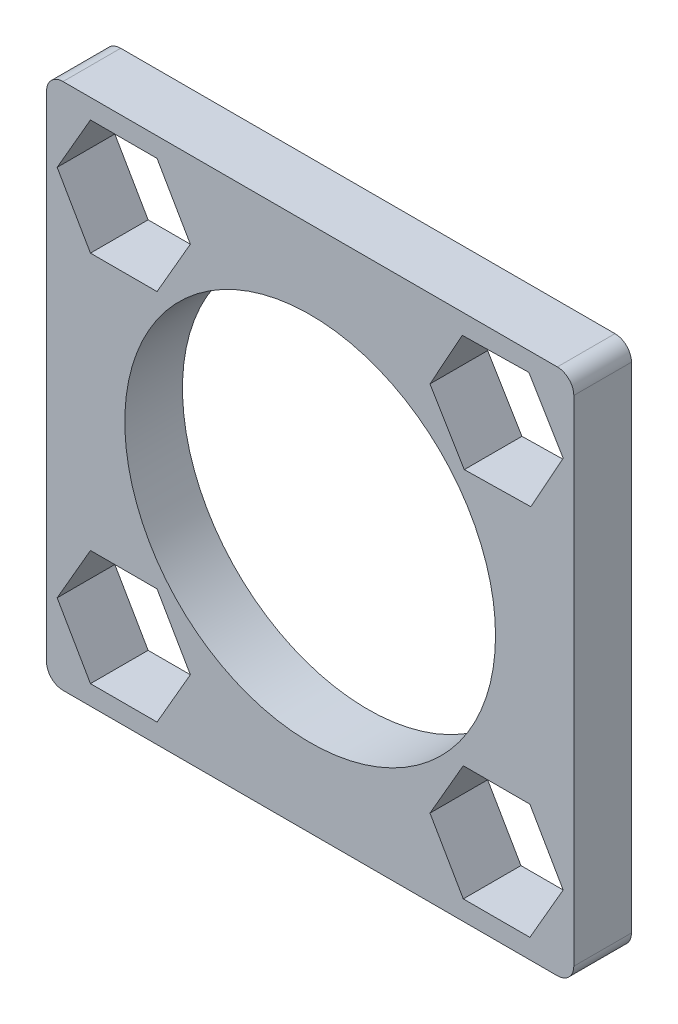
ISO-10303-21;
HEADER;
FILE_DESCRIPTION(('STEP AP214'),'2;1');
FILE_NAME('part.step','',(''),(''),'','','');
FILE_SCHEMA(('AUTOMOTIVE_DESIGN { 1 0 10303 214 1 1 1 1 }'));
ENDSEC;
DATA;
#1=APPLICATION_CONTEXT('core data for automotive mechanical design processes');
#2=APPLICATION_PROTOCOL_DEFINITION('international standard','automotive_design',2000,#1);
#3=PRODUCT_CONTEXT('',#1,'mechanical');
#4=PRODUCT('Part','Part','',(#3));
#5=PRODUCT_RELATED_PRODUCT_CATEGORY('part','',(#4));
#6=PRODUCT_DEFINITION_FORMATION('','',#4);
#7=PRODUCT_DEFINITION_CONTEXT('part definition',#1,'design');
#8=PRODUCT_DEFINITION('design','',#6,#7);
#9=PRODUCT_DEFINITION_SHAPE('','',#8);
#10=(LENGTH_UNIT() NAMED_UNIT(*) SI_UNIT(.MILLI.,.METRE.));
#11=(NAMED_UNIT(*) PLANE_ANGLE_UNIT() SI_UNIT($,.RADIAN.));
#12=(NAMED_UNIT(*) SI_UNIT($,.STERADIAN.) SOLID_ANGLE_UNIT());
#13=UNCERTAINTY_MEASURE_WITH_UNIT(LENGTH_MEASURE(1.E-05),#10,'distance_accuracy_value','');
#14=(GEOMETRIC_REPRESENTATION_CONTEXT(3) GLOBAL_UNCERTAINTY_ASSIGNED_CONTEXT((#13)) GLOBAL_UNIT_ASSIGNED_CONTEXT((#10,
#11,#12)) REPRESENTATION_CONTEXT('',''));
#15=CARTESIAN_POINT('',(0.,0.,0.));
#16=DIRECTION('',(0.,0.,1.));
#17=DIRECTION('',(1.,0.,0.));
#18=AXIS2_PLACEMENT_3D('',#15,#16,#17);
#19=CARTESIAN_POINT('',(-15.,-15.,3.5));
#20=DIRECTION('',(0.,0.,1.));
#21=DIRECTION('',(1.,0.,0.));
#22=AXIS2_PLACEMENT_3D('',#19,#20,#21);
#23=PLANE('',#22);
#24=CARTESIAN_POINT('',(-15.,-15.,3.5));
#25=DIRECTION('',(0.,0.,1.));
#26=DIRECTION('',(1.,0.,0.));
#27=AXIS2_PLACEMENT_3D('',#24,#25,#26);
#28=CIRCLE('',#27,1.);
#29=CARTESIAN_POINT('',(-16.,-15.,3.5));
#30=VERTEX_POINT('',#29);
#31=CARTESIAN_POINT('',(-15.,-16.,3.5));
#32=VERTEX_POINT('',#31);
#33=EDGE_CURVE('E434',#30,#32,#28,.T.);
#34=ORIENTED_EDGE('',*,*,#33,.T.);
#35=DIRECTION('',(1.,0.,0.));
#36=VECTOR('',#35,1.);
#37=CARTESIAN_POINT('',(-15.,-16.,3.5));
#38=LINE('',#37,#36);
#39=CARTESIAN_POINT('',(15.,-16.,3.5));
#40=VERTEX_POINT('',#39);
#41=EDGE_CURVE('E437',#32,#40,#38,.T.);
#42=ORIENTED_EDGE('',*,*,#41,.T.);
#43=CARTESIAN_POINT('',(15.,-15.,3.5));
#44=DIRECTION('',(0.,0.,1.));
#45=DIRECTION('',(1.,0.,0.));
#46=AXIS2_PLACEMENT_3D('',#43,#44,#45);
#47=CIRCLE('',#46,0.999999999999999);
#48=CARTESIAN_POINT('',(16.,-15.,3.5));
#49=VERTEX_POINT('',#48);
#50=EDGE_CURVE('E440',#40,#49,#47,.T.);
#51=ORIENTED_EDGE('',*,*,#50,.T.);
#52=DIRECTION('',(0.,1.,0.));
#53=VECTOR('',#52,1.);
#54=CARTESIAN_POINT('',(16.,15.,3.5));
#55=LINE('',#54,#53);
#56=CARTESIAN_POINT('',(16.,15.,3.5));
#57=VERTEX_POINT('',#56);
#58=EDGE_CURVE('E442',#49,#57,#55,.T.);
#59=ORIENTED_EDGE('',*,*,#58,.T.);
#60=CARTESIAN_POINT('',(15.,15.,3.5));
#61=DIRECTION('',(0.,0.,1.));
#62=DIRECTION('',(-1.,0.,0.));
#63=AXIS2_PLACEMENT_3D('',#60,#61,#62);
#64=CIRCLE('',#63,1.);
#65=CARTESIAN_POINT('',(15.,16.,3.5));
#66=VERTEX_POINT('',#65);
#67=EDGE_CURVE('E444',#57,#66,#64,.T.);
#68=ORIENTED_EDGE('',*,*,#67,.T.);
#69=DIRECTION('',(-1.,0.,0.));
#70=VECTOR('',#69,1.);
#71=CARTESIAN_POINT('',(-15.,16.,3.5));
#72=LINE('',#71,#70);
#73=CARTESIAN_POINT('',(-15.,16.,3.5));
#74=VERTEX_POINT('',#73);
#75=EDGE_CURVE('E446',#66,#74,#72,.T.);
#76=ORIENTED_EDGE('',*,*,#75,.T.);
#77=CARTESIAN_POINT('',(-15.,15.,3.5));
#78=DIRECTION('',(0.,0.,1.));
#79=DIRECTION('',(1.,0.,0.));
#80=AXIS2_PLACEMENT_3D('',#77,#78,#79);
#81=CIRCLE('',#80,1.);
#82=CARTESIAN_POINT('',(-16.,15.,3.5));
#83=VERTEX_POINT('',#82);
#84=EDGE_CURVE('E448',#74,#83,#81,.T.);
#85=ORIENTED_EDGE('',*,*,#84,.T.);
#86=DIRECTION('',(0.,-1.,0.));
#87=VECTOR('',#86,1.);
#88=CARTESIAN_POINT('',(-16.,15.,3.5));
#89=LINE('',#88,#87);
#90=EDGE_CURVE('E450',#83,#30,#89,.T.);
#91=ORIENTED_EDGE('',*,*,#90,.T.);
#92=EDGE_LOOP('',(#34,#42,#51,#59,#68,#76,#85,#91));
#93=FACE_BOUND('',#92,.T.);
#94=CARTESIAN_POINT('',(0.,0.,3.5));
#95=DIRECTION('',(0.,0.,1.));
#96=DIRECTION('',(1.,0.,0.));
#97=AXIS2_PLACEMENT_3D('',#94,#95,#96);
#98=CIRCLE('',#97,11.25);
#99=CARTESIAN_POINT('',(11.25,0.,3.5));
#100=VERTEX_POINT('',#99);
#101=EDGE_CURVE('E428',#100,#100,#98,.T.);
#102=ORIENTED_EDGE('',*,*,#101,.F.);
#103=EDGE_LOOP('',(#102));
#104=FACE_BOUND('',#103,.T.);
#105=DIRECTION('',(-0.5,0.866025403784438,0.));
#106=VECTOR('',#105,1.);
#107=CARTESIAN_POINT('',(-7.27225661465738,11.3137084989848,3.5));
#108=LINE('',#107,#106);
#109=CARTESIAN_POINT('',(-7.27225661465738,11.3137084989848,3.5));
#110=VERTEX_POINT('',#109);
#111=CARTESIAN_POINT('',(-9.29298255682108,14.8137084989848,3.5));
#112=VERTEX_POINT('',#111);
#113=EDGE_CURVE('E385',#110,#112,#108,.T.);
#114=ORIENTED_EDGE('',*,*,#113,.F.);
#115=DIRECTION('',(0.5,0.866025403784439,0.));
#116=VECTOR('',#115,1.);
#117=CARTESIAN_POINT('',(-9.29298255682107,7.81370849898475,3.5));
#118=LINE('',#117,#116);
#119=CARTESIAN_POINT('',(-9.29298255682107,7.81370849898475,3.5));
#120=VERTEX_POINT('',#119);
#121=EDGE_CURVE('E383',#120,#110,#118,.T.);
#122=ORIENTED_EDGE('',*,*,#121,.F.);
#123=DIRECTION('',(1.,0.,0.));
#124=VECTOR('',#123,1.);
#125=CARTESIAN_POINT('',(-13.3344344411485,7.81370849898475,3.5));
#126=LINE('',#125,#124);
#127=CARTESIAN_POINT('',(-13.3344344411485,7.81370849898475,3.5));
#128=VERTEX_POINT('',#127);
#129=EDGE_CURVE('E395',#128,#120,#126,.T.);
#130=ORIENTED_EDGE('',*,*,#129,.F.);
#131=DIRECTION('',(0.5,-0.866025403784438,0.));
#132=VECTOR('',#131,1.);
#133=CARTESIAN_POINT('',(-15.3551603833122,11.3137084989848,3.5));
#134=LINE('',#133,#132);
#135=CARTESIAN_POINT('',(-15.3551603833122,11.3137084989848,3.5));
#136=VERTEX_POINT('',#135);
#137=EDGE_CURVE('E392',#136,#128,#134,.T.);
#138=ORIENTED_EDGE('',*,*,#137,.F.);
#139=DIRECTION('',(-0.5,-0.866025403784438,0.));
#140=VECTOR('',#139,1.);
#141=CARTESIAN_POINT('',(-13.3344344411485,14.8137084989848,3.5));
#142=LINE('',#141,#140);
#143=CARTESIAN_POINT('',(-13.3344344411485,14.8137084989848,3.5));
#144=VERTEX_POINT('',#143);
#145=EDGE_CURVE('E390',#144,#136,#142,.T.);
#146=ORIENTED_EDGE('',*,*,#145,.F.);
#147=DIRECTION('',(-1.,0.,0.));
#148=VECTOR('',#147,1.);
#149=CARTESIAN_POINT('',(-9.29298255682108,14.8137084989848,3.5));
#150=LINE('',#149,#148);
#151=EDGE_CURVE('E388',#112,#144,#150,.T.);
#152=ORIENTED_EDGE('',*,*,#151,.F.);
#153=EDGE_LOOP('',(#114,#122,#130,#138,#146,#152));
#154=FACE_BOUND('',#153,.T.);
#155=DIRECTION('',(0.514888429763945,-0.857257198800464,0.));
#156=VECTOR('',#155,1.);
#157=CARTESIAN_POINT('',(7.27285989583921,11.2438808555336,3.5));
#158=LINE('',#157,#156);
#159=CARTESIAN_POINT('',(7.27285989583921,11.2438808555336,3.5));
#160=VERTEX_POINT('',#159);
#161=CARTESIAN_POINT('',(9.35375671052707,7.77931713408829,3.5));
#162=VERTEX_POINT('',#161);
#163=EDGE_CURVE('E340',#160,#162,#158,.T.);
#164=ORIENTED_EDGE('',*,*,#163,.F.);
#165=DIRECTION('',(-0.484962296856316,-0.874535059690489,0.));
#166=VECTOR('',#165,1.);
#167=CARTESIAN_POINT('',(9.23281168429691,14.7782722204301,3.5));
#168=LINE('',#167,#166);
#169=CARTESIAN_POINT('',(9.23281168429691,14.7782722204301,3.5));
#170=VERTEX_POINT('',#169);
#171=EDGE_CURVE('E338',#170,#160,#168,.T.);
#172=ORIENTED_EDGE('',*,*,#171,.F.);
#173=DIRECTION('',(-0.999850726620261,-0.0172778608900245,0.));
#174=VECTOR('',#173,1.);
#175=CARTESIAN_POINT('',(13.2736602874425,14.8480998638813,3.5));
#176=LINE('',#175,#174);
#177=CARTESIAN_POINT('',(13.2736602874425,14.8480998638813,3.5));
#178=VERTEX_POINT('',#177);
#179=EDGE_CURVE('E350',#178,#170,#176,.T.);
#180=ORIENTED_EDGE('',*,*,#179,.F.);
#181=DIRECTION('',(-0.514888429763945,0.857257198800464,0.));
#182=VECTOR('',#181,1.);
#183=CARTESIAN_POINT('',(15.3545571021303,11.3835361424359,3.5));
#184=LINE('',#183,#182);
#185=CARTESIAN_POINT('',(15.3545571021303,11.3835361424359,3.5));
#186=VERTEX_POINT('',#185);
#187=EDGE_CURVE('E347',#186,#178,#184,.T.);
#188=ORIENTED_EDGE('',*,*,#187,.F.);
#189=DIRECTION('',(0.484962296856316,0.874535059690489,0.));
#190=VECTOR('',#189,1.);
#191=CARTESIAN_POINT('',(13.3946053136726,7.84914477753942,3.5));
#192=LINE('',#191,#190);
#193=CARTESIAN_POINT('',(13.3946053136726,7.84914477753942,3.5));
#194=VERTEX_POINT('',#193);
#195=EDGE_CURVE('E345',#194,#186,#192,.T.);
#196=ORIENTED_EDGE('',*,*,#195,.F.);
#197=DIRECTION('',(0.999850726620262,0.0172778608900245,0.));
#198=VECTOR('',#197,1.);
#199=CARTESIAN_POINT('',(9.35375671052707,7.77931713408829,3.5));
#200=LINE('',#199,#198);
#201=EDGE_CURVE('E343',#162,#194,#200,.T.);
#202=ORIENTED_EDGE('',*,*,#201,.F.);
#203=EDGE_LOOP('',(#164,#172,#180,#188,#196,#202));
#204=FACE_BOUND('',#203,.T.);
#205=DIRECTION('',(-0.500000000000001,0.866025403784438,0.));
#206=VECTOR('',#205,1.);
#207=CARTESIAN_POINT('',(-7.27225661465738,-11.3137084989848,3.5));
#208=LINE('',#207,#206);
#209=CARTESIAN_POINT('',(-7.27225661465738,-11.3137084989848,3.5));
#210=VERTEX_POINT('',#209);
#211=CARTESIAN_POINT('',(-9.29298255682108,-7.81370849898476,3.5));
#212=VERTEX_POINT('',#211);
#213=EDGE_CURVE('E295',#210,#212,#208,.T.);
#214=ORIENTED_EDGE('',*,*,#213,.F.);
#215=DIRECTION('',(0.499999999999995,0.866025403784442,0.));
#216=VECTOR('',#215,1.);
#217=CARTESIAN_POINT('',(-9.29298255682103,-14.8137084989847,3.5));
#218=LINE('',#217,#216);
#219=CARTESIAN_POINT('',(-9.29298255682103,-14.8137084989847,3.5));
#220=VERTEX_POINT('',#219);
#221=EDGE_CURVE('E293',#220,#210,#218,.T.);
#222=ORIENTED_EDGE('',*,*,#221,.F.);
#223=DIRECTION('',(1.,0.,0.));
#224=VECTOR('',#223,1.);
#225=CARTESIAN_POINT('',(-13.3344344411484,-14.8137084989848,3.5));
#226=LINE('',#225,#224);
#227=CARTESIAN_POINT('',(-13.3344344411484,-14.8137084989848,3.5));
#228=VERTEX_POINT('',#227);
#229=EDGE_CURVE('E305',#228,#220,#226,.T.);
#230=ORIENTED_EDGE('',*,*,#229,.F.);
#231=DIRECTION('',(0.500000000000007,-0.866025403784435,0.));
#232=VECTOR('',#231,1.);
#233=CARTESIAN_POINT('',(-15.3551603833121,-11.3137084989848,3.5));
#234=LINE('',#233,#232);
#235=CARTESIAN_POINT('',(-15.3551603833121,-11.3137084989848,3.5));
#236=VERTEX_POINT('',#235);
#237=EDGE_CURVE('E302',#236,#228,#234,.T.);
#238=ORIENTED_EDGE('',*,*,#237,.F.);
#239=DIRECTION('',(-0.499999999999995,-0.866025403784442,0.));
#240=VECTOR('',#239,1.);
#241=CARTESIAN_POINT('',(-13.3344344411485,-7.81370849898477,3.5));
#242=LINE('',#241,#240);
#243=CARTESIAN_POINT('',(-13.3344344411485,-7.81370849898477,3.5));
#244=VERTEX_POINT('',#243);
#245=EDGE_CURVE('E300',#244,#236,#242,.T.);
#246=ORIENTED_EDGE('',*,*,#245,.F.);
#247=DIRECTION('',(-1.,0.,0.));
#248=VECTOR('',#247,1.);
#249=CARTESIAN_POINT('',(-9.29298255682108,-7.81370849898476,3.5));
#250=LINE('',#249,#248);
#251=EDGE_CURVE('E298',#212,#244,#250,.T.);
#252=ORIENTED_EDGE('',*,*,#251,.F.);
#253=EDGE_LOOP('',(#214,#222,#230,#238,#246,#252));
#254=FACE_BOUND('',#253,.T.);
#255=DIRECTION('',(-0.5,0.866025403784438,0.));
#256=VECTOR('',#255,1.);
#257=CARTESIAN_POINT('',(15.3551603833121,-11.3137084989848,3.5));
#258=LINE('',#257,#256);
#259=CARTESIAN_POINT('',(15.3551603833121,-11.3137084989848,3.5));
#260=VERTEX_POINT('',#259);
#261=CARTESIAN_POINT('',(13.3344344411484,-7.81370849898475,3.5));
#262=VERTEX_POINT('',#261);
#263=EDGE_CURVE('E250',#260,#262,#258,.T.);
#264=ORIENTED_EDGE('',*,*,#263,.F.);
#265=DIRECTION('',(0.5,0.866025403784439,0.));
#266=VECTOR('',#265,1.);
#267=CARTESIAN_POINT('',(13.3344344411484,-14.8137084989848,3.5));
#268=LINE('',#267,#266);
#269=CARTESIAN_POINT('',(13.3344344411484,-14.8137084989848,3.5));
#270=VERTEX_POINT('',#269);
#271=EDGE_CURVE('E242',#270,#260,#268,.T.);
#272=ORIENTED_EDGE('',*,*,#271,.F.);
#273=DIRECTION('',(1.,0.,0.));
#274=VECTOR('',#273,1.);
#275=CARTESIAN_POINT('',(9.29298255682106,-14.8137084989848,3.5));
#276=LINE('',#275,#274);
#277=CARTESIAN_POINT('',(9.29298255682106,-14.8137084989848,3.5));
#278=VERTEX_POINT('',#277);
#279=EDGE_CURVE('E271',#278,#270,#276,.T.);
#280=ORIENTED_EDGE('',*,*,#279,.F.);
#281=DIRECTION('',(0.5,-0.866025403784438,0.));
#282=VECTOR('',#281,1.);
#283=CARTESIAN_POINT('',(7.27225661465737,-11.3137084989848,3.5));
#284=LINE('',#283,#282);
#285=CARTESIAN_POINT('',(7.27225661465737,-11.3137084989848,3.5));
#286=VERTEX_POINT('',#285);
#287=EDGE_CURVE('E269',#286,#278,#284,.T.);
#288=ORIENTED_EDGE('',*,*,#287,.F.);
#289=DIRECTION('',(-0.5,-0.866025403784439,0.));
#290=VECTOR('',#289,1.);
#291=CARTESIAN_POINT('',(9.29298255682106,-7.81370849898475,3.5));
#292=LINE('',#291,#290);
#293=CARTESIAN_POINT('',(9.29298255682106,-7.81370849898475,3.5));
#294=VERTEX_POINT('',#293);
#295=EDGE_CURVE('E265',#294,#286,#292,.T.);
#296=ORIENTED_EDGE('',*,*,#295,.F.);
#297=DIRECTION('',(-1.,0.,0.));
#298=VECTOR('',#297,1.);
#299=CARTESIAN_POINT('',(13.3344344411484,-7.81370849898475,3.5));
#300=LINE('',#299,#298);
#301=EDGE_CURVE('E263',#262,#294,#300,.T.);
#302=ORIENTED_EDGE('',*,*,#301,.F.);
#303=EDGE_LOOP('',(#264,#272,#280,#288,#296,#302));
#304=FACE_BOUND('',#303,.T.);
#305=ADVANCED_FACE('F33',(#93,#104,#154,#204,#254,#304),#23,.T.);
#306=CARTESIAN_POINT('',(-15.,-15.,0.));
#307=DIRECTION('',(0.,0.,1.));
#308=DIRECTION('',(1.,0.,0.));
#309=AXIS2_PLACEMENT_3D('',#306,#307,#308);
#310=PLANE('',#309);
#311=DIRECTION('',(0.499999999999995,0.866025403784442,0.));
#312=VECTOR('',#311,1.);
#313=CARTESIAN_POINT('',(-9.29298255682103,-14.8137084989847,0.));
#314=LINE('',#313,#312);
#315=CARTESIAN_POINT('',(-9.29298255682103,-14.8137084989847,0.));
#316=VERTEX_POINT('',#315);
#317=CARTESIAN_POINT('',(-7.27225661465738,-11.3137084989848,0.));
#318=VERTEX_POINT('',#317);
#319=EDGE_CURVE('E258',#316,#318,#314,.T.);
#320=ORIENTED_EDGE('',*,*,#319,.T.);
#321=DIRECTION('',(-0.500000000000001,0.866025403784438,0.));
#322=VECTOR('',#321,1.);
#323=CARTESIAN_POINT('',(-7.27225661465738,-11.3137084989848,0.));
#324=LINE('',#323,#322);
#325=CARTESIAN_POINT('',(-9.29298255682108,-7.81370849898476,0.));
#326=VERTEX_POINT('',#325);
#327=EDGE_CURVE('E310',#318,#326,#324,.T.);
#328=ORIENTED_EDGE('',*,*,#327,.T.);
#329=DIRECTION('',(-1.,0.,0.));
#330=VECTOR('',#329,1.);
#331=CARTESIAN_POINT('',(-9.29298255682108,-7.81370849898476,0.));
#332=LINE('',#331,#330);
#333=CARTESIAN_POINT('',(-13.3344344411485,-7.81370849898477,0.));
#334=VERTEX_POINT('',#333);
#335=EDGE_CURVE('E313',#326,#334,#332,.T.);
#336=ORIENTED_EDGE('',*,*,#335,.T.);
#337=DIRECTION('',(-0.499999999999995,-0.866025403784442,0.));
#338=VECTOR('',#337,1.);
#339=CARTESIAN_POINT('',(-13.3344344411485,-7.81370849898477,0.));
#340=LINE('',#339,#338);
#341=CARTESIAN_POINT('',(-15.3551603833121,-11.3137084989848,0.));
#342=VERTEX_POINT('',#341);
#343=EDGE_CURVE('E316',#334,#342,#340,.T.);
#344=ORIENTED_EDGE('',*,*,#343,.T.);
#345=DIRECTION('',(0.500000000000007,-0.866025403784435,0.));
#346=VECTOR('',#345,1.);
#347=CARTESIAN_POINT('',(-15.3551603833121,-11.3137084989848,0.));
#348=LINE('',#347,#346);
#349=CARTESIAN_POINT('',(-13.3344344411484,-14.8137084989848,0.));
#350=VERTEX_POINT('',#349);
#351=EDGE_CURVE('E319',#342,#350,#348,.T.);
#352=ORIENTED_EDGE('',*,*,#351,.T.);
#353=DIRECTION('',(1.,0.,0.));
#354=VECTOR('',#353,1.);
#355=CARTESIAN_POINT('',(-13.3344344411484,-14.8137084989848,0.));
#356=LINE('',#355,#354);
#357=EDGE_CURVE('E296',#350,#316,#356,.T.);
#358=ORIENTED_EDGE('',*,*,#357,.T.);
#359=EDGE_LOOP('',(#320,#328,#336,#344,#352,#358));
#360=FACE_BOUND('',#359,.T.);
#361=DIRECTION('',(0.5,0.866025403784439,0.));
#362=VECTOR('',#361,1.);
#363=CARTESIAN_POINT('',(-9.29298255682107,7.81370849898475,0.));
#364=LINE('',#363,#362);
#365=CARTESIAN_POINT('',(-9.29298255682107,7.81370849898475,0.));
#366=VERTEX_POINT('',#365);
#367=CARTESIAN_POINT('',(-7.27225661465738,11.3137084989848,0.));
#368=VERTEX_POINT('',#367);
#369=EDGE_CURVE('E382',#366,#368,#364,.T.);
#370=ORIENTED_EDGE('',*,*,#369,.T.);
#371=DIRECTION('',(-0.5,0.866025403784438,0.));
#372=VECTOR('',#371,1.);
#373=CARTESIAN_POINT('',(-7.27225661465738,11.3137084989848,0.));
#374=LINE('',#373,#372);
#375=CARTESIAN_POINT('',(-9.29298255682108,14.8137084989848,0.));
#376=VERTEX_POINT('',#375);
#377=EDGE_CURVE('E400',#368,#376,#374,.T.);
#378=ORIENTED_EDGE('',*,*,#377,.T.);
#379=DIRECTION('',(-1.,0.,0.));
#380=VECTOR('',#379,1.);
#381=CARTESIAN_POINT('',(-9.29298255682108,14.8137084989848,0.));
#382=LINE('',#381,#380);
#383=CARTESIAN_POINT('',(-13.3344344411485,14.8137084989848,0.));
#384=VERTEX_POINT('',#383);
#385=EDGE_CURVE('E403',#376,#384,#382,.T.);
#386=ORIENTED_EDGE('',*,*,#385,.T.);
#387=DIRECTION('',(-0.5,-0.866025403784438,0.));
#388=VECTOR('',#387,1.);
#389=CARTESIAN_POINT('',(-13.3344344411485,14.8137084989848,0.));
#390=LINE('',#389,#388);
#391=CARTESIAN_POINT('',(-15.3551603833122,11.3137084989848,0.));
#392=VERTEX_POINT('',#391);
#393=EDGE_CURVE('E406',#384,#392,#390,.T.);
#394=ORIENTED_EDGE('',*,*,#393,.T.);
#395=DIRECTION('',(0.5,-0.866025403784438,0.));
#396=VECTOR('',#395,1.);
#397=CARTESIAN_POINT('',(-15.3551603833122,11.3137084989848,0.));
#398=LINE('',#397,#396);
#399=CARTESIAN_POINT('',(-13.3344344411485,7.81370849898475,0.));
#400=VERTEX_POINT('',#399);
#401=EDGE_CURVE('E409',#392,#400,#398,.T.);
#402=ORIENTED_EDGE('',*,*,#401,.T.);
#403=DIRECTION('',(1.,0.,0.));
#404=VECTOR('',#403,1.);
#405=CARTESIAN_POINT('',(-13.3344344411485,7.81370849898475,0.));
#406=LINE('',#405,#404);
#407=EDGE_CURVE('E386',#400,#366,#406,.T.);
#408=ORIENTED_EDGE('',*,*,#407,.T.);
#409=EDGE_LOOP('',(#370,#378,#386,#394,#402,#408));
#410=FACE_BOUND('',#409,.T.);
#411=CARTESIAN_POINT('',(-15.,-15.,0.));
#412=DIRECTION('',(0.,0.,1.));
#413=DIRECTION('',(1.,0.,0.));
#414=AXIS2_PLACEMENT_3D('',#411,#412,#413);
#415=CIRCLE('',#414,1.);
#416=CARTESIAN_POINT('',(-16.,-15.,0.));
#417=VERTEX_POINT('',#416);
#418=CARTESIAN_POINT('',(-15.,-16.,0.));
#419=VERTEX_POINT('',#418);
#420=EDGE_CURVE('E431',#417,#419,#415,.T.);
#421=ORIENTED_EDGE('',*,*,#420,.F.);
#422=DIRECTION('',(0.,-1.,0.));
#423=VECTOR('',#422,1.);
#424=CARTESIAN_POINT('',(-16.,15.,0.));
#425=LINE('',#424,#423);
#426=CARTESIAN_POINT('',(-16.,15.,0.));
#427=VERTEX_POINT('',#426);
#428=EDGE_CURVE('E438',#427,#417,#425,.T.);
#429=ORIENTED_EDGE('',*,*,#428,.F.);
#430=CARTESIAN_POINT('',(-15.,15.,0.));
#431=DIRECTION('',(0.,0.,1.));
#432=DIRECTION('',(1.,0.,0.));
#433=AXIS2_PLACEMENT_3D('',#430,#431,#432);
#434=CIRCLE('',#433,1.);
#435=CARTESIAN_POINT('',(-15.,16.,0.));
#436=VERTEX_POINT('',#435);
#437=EDGE_CURVE('E465',#436,#427,#434,.T.);
#438=ORIENTED_EDGE('',*,*,#437,.F.);
#439=DIRECTION('',(-1.,0.,0.));
#440=VECTOR('',#439,1.);
#441=CARTESIAN_POINT('',(-15.,16.,0.));
#442=LINE('',#441,#440);
#443=CARTESIAN_POINT('',(15.,16.,0.));
#444=VERTEX_POINT('',#443);
#445=EDGE_CURVE('E463',#444,#436,#442,.T.);
#446=ORIENTED_EDGE('',*,*,#445,.F.);
#447=CARTESIAN_POINT('',(15.,15.,0.));
#448=DIRECTION('',(0.,0.,1.));
#449=DIRECTION('',(-1.,0.,0.));
#450=AXIS2_PLACEMENT_3D('',#447,#448,#449);
#451=CIRCLE('',#450,1.);
#452=CARTESIAN_POINT('',(16.,15.,0.));
#453=VERTEX_POINT('',#452);
#454=EDGE_CURVE('E461',#453,#444,#451,.T.);
#455=ORIENTED_EDGE('',*,*,#454,.F.);
#456=DIRECTION('',(0.,1.,0.));
#457=VECTOR('',#456,1.);
#458=CARTESIAN_POINT('',(16.,15.,0.));
#459=LINE('',#458,#457);
#460=CARTESIAN_POINT('',(16.,-15.,0.));
#461=VERTEX_POINT('',#460);
#462=EDGE_CURVE('E459',#461,#453,#459,.T.);
#463=ORIENTED_EDGE('',*,*,#462,.F.);
#464=CARTESIAN_POINT('',(15.,-15.,0.));
#465=DIRECTION('',(0.,0.,1.));
#466=DIRECTION('',(1.,0.,0.));
#467=AXIS2_PLACEMENT_3D('',#464,#465,#466);
#468=CIRCLE('',#467,0.999999999999999);
#469=CARTESIAN_POINT('',(15.,-16.,0.));
#470=VERTEX_POINT('',#469);
#471=EDGE_CURVE('E457',#470,#461,#468,.T.);
#472=ORIENTED_EDGE('',*,*,#471,.F.);
#473=DIRECTION('',(1.,0.,0.));
#474=VECTOR('',#473,1.);
#475=CARTESIAN_POINT('',(-15.,-16.,0.));
#476=LINE('',#475,#474);
#477=EDGE_CURVE('E455',#419,#470,#476,.T.);
#478=ORIENTED_EDGE('',*,*,#477,.F.);
#479=EDGE_LOOP('',(#421,#429,#438,#446,#455,#463,#472,#478));
#480=FACE_BOUND('',#479,.T.);
#481=CARTESIAN_POINT('',(0.,0.,0.));
#482=DIRECTION('',(0.,0.,1.));
#483=DIRECTION('',(1.,0.,0.));
#484=AXIS2_PLACEMENT_3D('',#481,#482,#483);
#485=CIRCLE('',#484,11.25);
#486=CARTESIAN_POINT('',(11.25,0.,0.));
#487=VERTEX_POINT('',#486);
#488=EDGE_CURVE('E427',#487,#487,#485,.T.);
#489=ORIENTED_EDGE('',*,*,#488,.T.);
#490=EDGE_LOOP('',(#489));
#491=FACE_BOUND('',#490,.T.);
#492=DIRECTION('',(-0.484962296856316,-0.874535059690489,0.));
#493=VECTOR('',#492,1.);
#494=CARTESIAN_POINT('',(9.23281168429691,14.7782722204301,0.));
#495=LINE('',#494,#493);
#496=CARTESIAN_POINT('',(9.23281168429691,14.7782722204301,0.));
#497=VERTEX_POINT('',#496);
#498=CARTESIAN_POINT('',(7.27285989583921,11.2438808555336,0.));
#499=VERTEX_POINT('',#498);
#500=EDGE_CURVE('E337',#497,#499,#495,.T.);
#501=ORIENTED_EDGE('',*,*,#500,.T.);
#502=DIRECTION('',(0.514888429763945,-0.857257198800464,0.));
#503=VECTOR('',#502,1.);
#504=CARTESIAN_POINT('',(7.27285989583921,11.2438808555336,0.));
#505=LINE('',#504,#503);
#506=CARTESIAN_POINT('',(9.35375671052707,7.77931713408829,0.));
#507=VERTEX_POINT('',#506);
#508=EDGE_CURVE('E355',#499,#507,#505,.T.);
#509=ORIENTED_EDGE('',*,*,#508,.T.);
#510=DIRECTION('',(0.999850726620262,0.0172778608900245,0.));
#511=VECTOR('',#510,1.);
#512=CARTESIAN_POINT('',(9.35375671052707,7.77931713408829,0.));
#513=LINE('',#512,#511);
#514=CARTESIAN_POINT('',(13.3946053136726,7.84914477753942,0.));
#515=VERTEX_POINT('',#514);
#516=EDGE_CURVE('E358',#507,#515,#513,.T.);
#517=ORIENTED_EDGE('',*,*,#516,.T.);
#518=DIRECTION('',(0.484962296856316,0.874535059690489,0.));
#519=VECTOR('',#518,1.);
#520=CARTESIAN_POINT('',(13.3946053136726,7.84914477753942,0.));
#521=LINE('',#520,#519);
#522=CARTESIAN_POINT('',(15.3545571021303,11.3835361424359,0.));
#523=VERTEX_POINT('',#522);
#524=EDGE_CURVE('E361',#515,#523,#521,.T.);
#525=ORIENTED_EDGE('',*,*,#524,.T.);
#526=DIRECTION('',(-0.514888429763945,0.857257198800464,0.));
#527=VECTOR('',#526,1.);
#528=CARTESIAN_POINT('',(15.3545571021303,11.3835361424359,0.));
#529=LINE('',#528,#527);
#530=CARTESIAN_POINT('',(13.2736602874425,14.8480998638813,0.));
#531=VERTEX_POINT('',#530);
#532=EDGE_CURVE('E364',#523,#531,#529,.T.);
#533=ORIENTED_EDGE('',*,*,#532,.T.);
#534=DIRECTION('',(-0.999850726620261,-0.0172778608900245,0.));
#535=VECTOR('',#534,1.);
#536=CARTESIAN_POINT('',(13.2736602874425,14.8480998638813,0.));
#537=LINE('',#536,#535);
#538=EDGE_CURVE('E341',#531,#497,#537,.T.);
#539=ORIENTED_EDGE('',*,*,#538,.T.);
#540=EDGE_LOOP('',(#501,#509,#517,#525,#533,#539));
#541=FACE_BOUND('',#540,.T.);
#542=DIRECTION('',(0.5,0.866025403784439,0.));
#543=VECTOR('',#542,1.);
#544=CARTESIAN_POINT('',(13.3344344411484,-14.8137084989848,0.));
#545=LINE('',#544,#543);
#546=CARTESIAN_POINT('',(13.3344344411484,-14.8137084989848,0.));
#547=VERTEX_POINT('',#546);
#548=CARTESIAN_POINT('',(15.3551603833121,-11.3137084989848,0.));
#549=VERTEX_POINT('',#548);
#550=EDGE_CURVE('E56',#547,#549,#545,.T.);
#551=ORIENTED_EDGE('',*,*,#550,.T.);
#552=DIRECTION('',(-0.5,0.866025403784438,0.));
#553=VECTOR('',#552,1.);
#554=CARTESIAN_POINT('',(15.3551603833121,-11.3137084989848,0.));
#555=LINE('',#554,#553);
#556=CARTESIAN_POINT('',(13.3344344411484,-7.81370849898475,0.));
#557=VERTEX_POINT('',#556);
#558=EDGE_CURVE('E257',#549,#557,#555,.T.);
#559=ORIENTED_EDGE('',*,*,#558,.T.);
#560=DIRECTION('',(-1.,0.,0.));
#561=VECTOR('',#560,1.);
#562=CARTESIAN_POINT('',(13.3344344411484,-7.81370849898475,0.));
#563=LINE('',#562,#561);
#564=CARTESIAN_POINT('',(9.29298255682106,-7.81370849898475,0.));
#565=VERTEX_POINT('',#564);
#566=EDGE_CURVE('E275',#557,#565,#563,.T.);
#567=ORIENTED_EDGE('',*,*,#566,.T.);
#568=DIRECTION('',(-0.5,-0.866025403784439,0.));
#569=VECTOR('',#568,1.);
#570=CARTESIAN_POINT('',(9.29298255682106,-7.81370849898475,0.));
#571=LINE('',#570,#569);
#572=CARTESIAN_POINT('',(7.27225661465737,-11.3137084989848,0.));
#573=VERTEX_POINT('',#572);
#574=EDGE_CURVE('E278',#565,#573,#571,.T.);
#575=ORIENTED_EDGE('',*,*,#574,.T.);
#576=DIRECTION('',(0.5,-0.866025403784438,0.));
#577=VECTOR('',#576,1.);
#578=CARTESIAN_POINT('',(7.27225661465737,-11.3137084989848,0.));
#579=LINE('',#578,#577);
#580=CARTESIAN_POINT('',(9.29298255682106,-14.8137084989848,0.));
#581=VERTEX_POINT('',#580);
#582=EDGE_CURVE('E281',#573,#581,#579,.T.);
#583=ORIENTED_EDGE('',*,*,#582,.T.);
#584=DIRECTION('',(1.,0.,0.));
#585=VECTOR('',#584,1.);
#586=CARTESIAN_POINT('',(9.29298255682106,-14.8137084989848,0.));
#587=LINE('',#586,#585);
#588=EDGE_CURVE('E251',#581,#547,#587,.T.);
#589=ORIENTED_EDGE('',*,*,#588,.T.);
#590=EDGE_LOOP('',(#551,#559,#567,#575,#583,#589));
#591=FACE_BOUND('',#590,.T.);
#592=ADVANCED_FACE('F495',(#360,#410,#480,#491,#541,#591),#310,.F.);
#593=CARTESIAN_POINT('',(-15.,-15.,3.5));
#594=DIRECTION('',(0.,0.,-1.));
#595=DIRECTION('',(-1.,0.,0.));
#596=AXIS2_PLACEMENT_3D('',#593,#594,#595);
#597=CYLINDRICAL_SURFACE('',#596,1.);
#598=ORIENTED_EDGE('',*,*,#420,.T.);
#599=DIRECTION('',(0.,0.,-1.));
#600=VECTOR('',#599,1.);
#601=CARTESIAN_POINT('',(-15.,-16.,3.5));
#602=LINE('',#601,#600);
#603=EDGE_CURVE('E11',#32,#419,#602,.T.);
#604=ORIENTED_EDGE('',*,*,#603,.F.);
#605=ORIENTED_EDGE('',*,*,#33,.F.);
#606=DIRECTION('',(0.,0.,-1.));
#607=VECTOR('',#606,1.);
#608=CARTESIAN_POINT('',(-16.,-15.,3.5));
#609=LINE('',#608,#607);
#610=EDGE_CURVE('E452',#30,#417,#609,.T.);
#611=ORIENTED_EDGE('',*,*,#610,.T.);
#612=EDGE_LOOP('',(#598,#604,#605,#611));
#613=FACE_BOUND('',#612,.T.);
#614=ADVANCED_FACE('F35',(#613),#597,.T.);
#615=CARTESIAN_POINT('',(-15.,-16.,3.5));
#616=DIRECTION('',(0.,1.,0.));
#617=DIRECTION('',(0.,0.,1.));
#618=AXIS2_PLACEMENT_3D('',#615,#616,#617);
#619=PLANE('',#618);
#620=ORIENTED_EDGE('',*,*,#477,.T.);
#621=DIRECTION('',(0.,0.,-1.));
#622=VECTOR('',#621,1.);
#623=CARTESIAN_POINT('',(15.,-16.,3.5));
#624=LINE('',#623,#622);
#625=EDGE_CURVE('E41',#40,#470,#624,.T.);
#626=ORIENTED_EDGE('',*,*,#625,.F.);
#627=ORIENTED_EDGE('',*,*,#41,.F.);
#628=ORIENTED_EDGE('',*,*,#603,.T.);
#629=EDGE_LOOP('',(#620,#626,#627,#628));
#630=FACE_BOUND('',#629,.T.);
#631=ADVANCED_FACE('F513',(#630),#619,.F.);
#632=CARTESIAN_POINT('',(15.,-15.,3.5));
#633=DIRECTION('',(0.,0.,-1.));
#634=DIRECTION('',(-1.,0.,0.));
#635=AXIS2_PLACEMENT_3D('',#632,#633,#634);
#636=CYLINDRICAL_SURFACE('',#635,0.999999999999999);
#637=ORIENTED_EDGE('',*,*,#471,.T.);
#638=DIRECTION('',(0.,0.,-1.));
#639=VECTOR('',#638,1.);
#640=CARTESIAN_POINT('',(16.,-15.,3.5));
#641=LINE('',#640,#639);
#642=EDGE_CURVE('E482',#49,#461,#641,.T.);
#643=ORIENTED_EDGE('',*,*,#642,.F.);
#644=ORIENTED_EDGE('',*,*,#50,.F.);
#645=ORIENTED_EDGE('',*,*,#625,.T.);
#646=EDGE_LOOP('',(#637,#643,#644,#645));
#647=FACE_BOUND('',#646,.T.);
#648=ADVANCED_FACE('F489',(#647),#636,.T.);
#649=CARTESIAN_POINT('',(16.,15.,3.5));
#650=DIRECTION('',(-1.,0.,0.));
#651=DIRECTION('',(0.,-1.,0.));
#652=AXIS2_PLACEMENT_3D('',#649,#650,#651);
#653=PLANE('',#652);
#654=ORIENTED_EDGE('',*,*,#462,.T.);
#655=DIRECTION('',(0.,0.,-1.));
#656=VECTOR('',#655,1.);
#657=CARTESIAN_POINT('',(16.,15.,3.5));
#658=LINE('',#657,#656);
#659=EDGE_CURVE('E479',#57,#453,#658,.T.);
#660=ORIENTED_EDGE('',*,*,#659,.F.);
#661=ORIENTED_EDGE('',*,*,#58,.F.);
#662=ORIENTED_EDGE('',*,*,#642,.T.);
#663=EDGE_LOOP('',(#654,#660,#661,#662));
#664=FACE_BOUND('',#663,.T.);
#665=ADVANCED_FACE('F501',(#664),#653,.F.);
#666=CARTESIAN_POINT('',(15.,15.,3.5));
#667=DIRECTION('',(0.,0.,-1.));
#668=DIRECTION('',(-1.,0.,0.));
#669=AXIS2_PLACEMENT_3D('',#666,#667,#668);
#670=CYLINDRICAL_SURFACE('',#669,1.);
#671=ORIENTED_EDGE('',*,*,#454,.T.);
#672=DIRECTION('',(0.,0.,-1.));
#673=VECTOR('',#672,1.);
#674=CARTESIAN_POINT('',(15.,16.,3.5));
#675=LINE('',#674,#673);
#676=EDGE_CURVE('E476',#66,#444,#675,.T.);
#677=ORIENTED_EDGE('',*,*,#676,.F.);
#678=ORIENTED_EDGE('',*,*,#67,.F.);
#679=ORIENTED_EDGE('',*,*,#659,.T.);
#680=EDGE_LOOP('',(#671,#677,#678,#679));
#681=FACE_BOUND('',#680,.T.);
#682=ADVANCED_FACE('F505',(#681),#670,.T.);
#683=CARTESIAN_POINT('',(-15.,16.,3.5));
#684=DIRECTION('',(0.,-1.,0.));
#685=DIRECTION('',(0.,0.,-1.));
#686=AXIS2_PLACEMENT_3D('',#683,#684,#685);
#687=PLANE('',#686);
#688=ORIENTED_EDGE('',*,*,#445,.T.);
#689=DIRECTION('',(0.,0.,-1.));
#690=VECTOR('',#689,1.);
#691=CARTESIAN_POINT('',(-15.,16.,3.5));
#692=LINE('',#691,#690);
#693=EDGE_CURVE('E473',#74,#436,#692,.T.);
#694=ORIENTED_EDGE('',*,*,#693,.F.);
#695=ORIENTED_EDGE('',*,*,#75,.F.);
#696=ORIENTED_EDGE('',*,*,#676,.T.);
#697=EDGE_LOOP('',(#688,#694,#695,#696));
#698=FACE_BOUND('',#697,.T.);
#699=ADVANCED_FACE('F526',(#698),#687,.F.);
#700=CARTESIAN_POINT('',(-15.,15.,3.5));
#701=DIRECTION('',(0.,0.,-1.));
#702=DIRECTION('',(-1.,0.,0.));
#703=AXIS2_PLACEMENT_3D('',#700,#701,#702);
#704=CYLINDRICAL_SURFACE('',#703,1.);
#705=ORIENTED_EDGE('',*,*,#437,.T.);
#706=DIRECTION('',(0.,0.,-1.));
#707=VECTOR('',#706,1.);
#708=CARTESIAN_POINT('',(-16.,15.,3.5));
#709=LINE('',#708,#707);
#710=EDGE_CURVE('E470',#83,#427,#709,.T.);
#711=ORIENTED_EDGE('',*,*,#710,.F.);
#712=ORIENTED_EDGE('',*,*,#84,.F.);
#713=ORIENTED_EDGE('',*,*,#693,.T.);
#714=EDGE_LOOP('',(#705,#711,#712,#713));
#715=FACE_BOUND('',#714,.T.);
#716=ADVANCED_FACE('F524',(#715),#704,.T.);
#717=CARTESIAN_POINT('',(-16.,15.,3.5));
#718=DIRECTION('',(1.,0.,0.));
#719=DIRECTION('',(0.,1.,0.));
#720=AXIS2_PLACEMENT_3D('',#717,#718,#719);
#721=PLANE('',#720);
#722=ORIENTED_EDGE('',*,*,#428,.T.);
#723=ORIENTED_EDGE('',*,*,#610,.F.);
#724=ORIENTED_EDGE('',*,*,#90,.F.);
#725=ORIENTED_EDGE('',*,*,#710,.T.);
#726=EDGE_LOOP('',(#722,#723,#724,#725));
#727=FACE_BOUND('',#726,.T.);
#728=ADVANCED_FACE('F519',(#727),#721,.F.);
#729=CARTESIAN_POINT('',(0.,0.,3.5));
#730=DIRECTION('',(0.,0.,-1.));
#731=DIRECTION('',(-1.,0.,0.));
#732=AXIS2_PLACEMENT_3D('',#729,#730,#731);
#733=CYLINDRICAL_SURFACE('',#732,11.25);
#734=ORIENTED_EDGE('',*,*,#101,.T.);
#735=EDGE_LOOP('',(#734));
#736=FACE_BOUND('',#735,.T.);
#737=ORIENTED_EDGE('',*,*,#488,.F.);
#738=EDGE_LOOP('',(#737));
#739=FACE_BOUND('',#738,.T.);
#740=ADVANCED_FACE('F543',(#736,#739),#733,.F.);
#741=CARTESIAN_POINT('',(-9.29298255682107,7.81370849898475,3.5));
#742=DIRECTION('',(-0.866025403784439,0.5,0.));
#743=DIRECTION('',(-0.5,-0.866025403784439,0.));
#744=AXIS2_PLACEMENT_3D('',#741,#742,#743);
#745=PLANE('',#744);
#746=ORIENTED_EDGE('',*,*,#369,.F.);
#747=DIRECTION('',(0.,0.,-1.));
#748=VECTOR('',#747,1.);
#749=CARTESIAN_POINT('',(-9.29298255682107,7.81370849898475,3.5));
#750=LINE('',#749,#748);
#751=EDGE_CURVE('E397',#120,#366,#750,.T.);
#752=ORIENTED_EDGE('',*,*,#751,.F.);
#753=ORIENTED_EDGE('',*,*,#121,.T.);
#754=DIRECTION('',(0.,0.,-1.));
#755=VECTOR('',#754,1.);
#756=CARTESIAN_POINT('',(-7.27225661465738,11.3137084989848,3.5));
#757=LINE('',#756,#755);
#758=EDGE_CURVE('E424',#110,#368,#757,.T.);
#759=ORIENTED_EDGE('',*,*,#758,.T.);
#760=EDGE_LOOP('',(#746,#752,#753,#759));
#761=FACE_BOUND('',#760,.T.);
#762=ADVANCED_FACE('F550',(#761),#745,.T.);
#763=CARTESIAN_POINT('',(-7.27225661465738,11.3137084989848,3.5));
#764=DIRECTION('',(-0.866025403784438,-0.5,0.));
#765=DIRECTION('',(0.5,-0.866025403784439,0.));
#766=AXIS2_PLACEMENT_3D('',#763,#764,#765);
#767=PLANE('',#766);
#768=ORIENTED_EDGE('',*,*,#377,.F.);
#769=ORIENTED_EDGE('',*,*,#758,.F.);
#770=ORIENTED_EDGE('',*,*,#113,.T.);
#771=DIRECTION('',(0.,0.,-1.));
#772=VECTOR('',#771,1.);
#773=CARTESIAN_POINT('',(-9.29298255682108,14.8137084989848,3.5));
#774=LINE('',#773,#772);
#775=EDGE_CURVE('E422',#112,#376,#774,.T.);
#776=ORIENTED_EDGE('',*,*,#775,.T.);
#777=EDGE_LOOP('',(#768,#769,#770,#776));
#778=FACE_BOUND('',#777,.T.);
#779=ADVANCED_FACE('F555',(#778),#767,.T.);
#780=CARTESIAN_POINT('',(-9.29298255682108,14.8137084989848,3.5));
#781=DIRECTION('',(0.,-1.,0.));
#782=DIRECTION('',(0.,0.,-1.));
#783=AXIS2_PLACEMENT_3D('',#780,#781,#782);
#784=PLANE('',#783);
#785=ORIENTED_EDGE('',*,*,#385,.F.);
#786=ORIENTED_EDGE('',*,*,#775,.F.);
#787=ORIENTED_EDGE('',*,*,#151,.T.);
#788=DIRECTION('',(0.,0.,-1.));
#789=VECTOR('',#788,1.);
#790=CARTESIAN_POINT('',(-13.3344344411485,14.8137084989848,3.5));
#791=LINE('',#790,#789);
#792=EDGE_CURVE('E420',#144,#384,#791,.T.);
#793=ORIENTED_EDGE('',*,*,#792,.T.);
#794=EDGE_LOOP('',(#785,#786,#787,#793));
#795=FACE_BOUND('',#794,.T.);
#796=ADVANCED_FACE('F646',(#795),#784,.T.);
#797=CARTESIAN_POINT('',(-13.3344344411485,14.8137084989848,3.5));
#798=DIRECTION('',(0.866025403784438,-0.5,0.));
#799=DIRECTION('',(0.5,0.866025403784439,0.));
#800=AXIS2_PLACEMENT_3D('',#797,#798,#799);
#801=PLANE('',#800);
#802=ORIENTED_EDGE('',*,*,#393,.F.);
#803=ORIENTED_EDGE('',*,*,#792,.F.);
#804=ORIENTED_EDGE('',*,*,#145,.T.);
#805=DIRECTION('',(0.,0.,-1.));
#806=VECTOR('',#805,1.);
#807=CARTESIAN_POINT('',(-15.3551603833122,11.3137084989848,3.5));
#808=LINE('',#807,#806);
#809=EDGE_CURVE('E418',#136,#392,#808,.T.);
#810=ORIENTED_EDGE('',*,*,#809,.T.);
#811=EDGE_LOOP('',(#802,#803,#804,#810));
#812=FACE_BOUND('',#811,.T.);
#813=ADVANCED_FACE('F642',(#812),#801,.T.);
#814=CARTESIAN_POINT('',(-15.3551603833122,11.3137084989848,3.5));
#815=DIRECTION('',(0.866025403784438,0.5,0.));
#816=DIRECTION('',(-0.5,0.866025403784439,0.));
#817=AXIS2_PLACEMENT_3D('',#814,#815,#816);
#818=PLANE('',#817);
#819=ORIENTED_EDGE('',*,*,#401,.F.);
#820=ORIENTED_EDGE('',*,*,#809,.F.);
#821=ORIENTED_EDGE('',*,*,#137,.T.);
#822=DIRECTION('',(0.,0.,-1.));
#823=VECTOR('',#822,1.);
#824=CARTESIAN_POINT('',(-13.3344344411485,7.81370849898475,3.5));
#825=LINE('',#824,#823);
#826=EDGE_CURVE('E416',#128,#400,#825,.T.);
#827=ORIENTED_EDGE('',*,*,#826,.T.);
#828=EDGE_LOOP('',(#819,#820,#821,#827));
#829=FACE_BOUND('',#828,.T.);
#830=ADVANCED_FACE('F638',(#829),#818,.T.);
#831=CARTESIAN_POINT('',(-13.3344344411485,7.81370849898475,3.5));
#832=DIRECTION('',(0.,1.,0.));
#833=DIRECTION('',(0.,0.,1.));
#834=AXIS2_PLACEMENT_3D('',#831,#832,#833);
#835=PLANE('',#834);
#836=ORIENTED_EDGE('',*,*,#407,.F.);
#837=ORIENTED_EDGE('',*,*,#826,.F.);
#838=ORIENTED_EDGE('',*,*,#129,.T.);
#839=ORIENTED_EDGE('',*,*,#751,.T.);
#840=EDGE_LOOP('',(#836,#837,#838,#839));
#841=FACE_BOUND('',#840,.T.);
#842=ADVANCED_FACE('F634',(#841),#835,.T.);
#843=CARTESIAN_POINT('',(9.23281168429691,14.7782722204301,3.5));
#844=DIRECTION('',(0.874535059690489,-0.484962296856316,0.));
#845=DIRECTION('',(0.484962296856316,0.874535059690489,0.));
#846=AXIS2_PLACEMENT_3D('',#843,#844,#845);
#847=PLANE('',#846);
#848=ORIENTED_EDGE('',*,*,#500,.F.);
#849=DIRECTION('',(0.,0.,-1.));
#850=VECTOR('',#849,1.);
#851=CARTESIAN_POINT('',(9.23281168429691,14.7782722204301,3.5));
#852=LINE('',#851,#850);
#853=EDGE_CURVE('E352',#170,#497,#852,.T.);
#854=ORIENTED_EDGE('',*,*,#853,.F.);
#855=ORIENTED_EDGE('',*,*,#171,.T.);
#856=DIRECTION('',(0.,0.,-1.));
#857=VECTOR('',#856,1.);
#858=CARTESIAN_POINT('',(7.27285989583921,11.2438808555336,3.5));
#859=LINE('',#858,#857);
#860=EDGE_CURVE('E379',#160,#499,#859,.T.);
#861=ORIENTED_EDGE('',*,*,#860,.T.);
#862=EDGE_LOOP('',(#848,#854,#855,#861));
#863=FACE_BOUND('',#862,.T.);
#864=ADVANCED_FACE('F630',(#863),#847,.T.);
#865=CARTESIAN_POINT('',(7.27285989583921,11.2438808555336,3.5));
#866=DIRECTION('',(0.857257198800464,0.514888429763945,0.));
#867=DIRECTION('',(-0.514888429763945,0.857257198800464,0.));
#868=AXIS2_PLACEMENT_3D('',#865,#866,#867);
#869=PLANE('',#868);
#870=ORIENTED_EDGE('',*,*,#508,.F.);
#871=ORIENTED_EDGE('',*,*,#860,.F.);
#872=ORIENTED_EDGE('',*,*,#163,.T.);
#873=DIRECTION('',(0.,0.,-1.));
#874=VECTOR('',#873,1.);
#875=CARTESIAN_POINT('',(9.35375671052707,7.77931713408829,3.5));
#876=LINE('',#875,#874);
#877=EDGE_CURVE('E377',#162,#507,#876,.T.);
#878=ORIENTED_EDGE('',*,*,#877,.T.);
#879=EDGE_LOOP('',(#870,#871,#872,#878));
#880=FACE_BOUND('',#879,.T.);
#881=ADVANCED_FACE('F626',(#880),#869,.T.);
#882=CARTESIAN_POINT('',(9.35375671052707,7.77931713408829,3.5));
#883=DIRECTION('',(-0.0172778608900245,0.999850726620262,0.));
#884=DIRECTION('',(-0.999850726620262,-0.0172778608900245,0.));
#885=AXIS2_PLACEMENT_3D('',#882,#883,#884);
#886=PLANE('',#885);
#887=ORIENTED_EDGE('',*,*,#516,.F.);
#888=ORIENTED_EDGE('',*,*,#877,.F.);
#889=ORIENTED_EDGE('',*,*,#201,.T.);
#890=DIRECTION('',(0.,0.,-1.));
#891=VECTOR('',#890,1.);
#892=CARTESIAN_POINT('',(13.3946053136726,7.84914477753942,3.5));
#893=LINE('',#892,#891);
#894=EDGE_CURVE('E375',#194,#515,#893,.T.);
#895=ORIENTED_EDGE('',*,*,#894,.T.);
#896=EDGE_LOOP('',(#887,#888,#889,#895));
#897=FACE_BOUND('',#896,.T.);
#898=ADVANCED_FACE('F622',(#897),#886,.T.);
#899=CARTESIAN_POINT('',(13.3946053136726,7.84914477753942,3.5));
#900=DIRECTION('',(-0.874535059690489,0.484962296856316,0.));
#901=DIRECTION('',(-0.484962296856316,-0.874535059690489,0.));
#902=AXIS2_PLACEMENT_3D('',#899,#900,#901);
#903=PLANE('',#902);
#904=ORIENTED_EDGE('',*,*,#524,.F.);
#905=ORIENTED_EDGE('',*,*,#894,.F.);
#906=ORIENTED_EDGE('',*,*,#195,.T.);
#907=DIRECTION('',(0.,0.,-1.));
#908=VECTOR('',#907,1.);
#909=CARTESIAN_POINT('',(15.3545571021303,11.3835361424359,3.5));
#910=LINE('',#909,#908);
#911=EDGE_CURVE('E373',#186,#523,#910,.T.);
#912=ORIENTED_EDGE('',*,*,#911,.T.);
#913=EDGE_LOOP('',(#904,#905,#906,#912));
#914=FACE_BOUND('',#913,.T.);
#915=ADVANCED_FACE('F618',(#914),#903,.T.);
#916=CARTESIAN_POINT('',(15.3545571021303,11.3835361424359,3.5));
#917=DIRECTION('',(-0.857257198800464,-0.514888429763945,0.));
#918=DIRECTION('',(0.514888429763945,-0.857257198800464,0.));
#919=AXIS2_PLACEMENT_3D('',#916,#917,#918);
#920=PLANE('',#919);
#921=ORIENTED_EDGE('',*,*,#532,.F.);
#922=ORIENTED_EDGE('',*,*,#911,.F.);
#923=ORIENTED_EDGE('',*,*,#187,.T.);
#924=DIRECTION('',(0.,0.,-1.));
#925=VECTOR('',#924,1.);
#926=CARTESIAN_POINT('',(13.2736602874425,14.8480998638813,3.5));
#927=LINE('',#926,#925);
#928=EDGE_CURVE('E371',#178,#531,#927,.T.);
#929=ORIENTED_EDGE('',*,*,#928,.T.);
#930=EDGE_LOOP('',(#921,#922,#923,#929));
#931=FACE_BOUND('',#930,.T.);
#932=ADVANCED_FACE('F614',(#931),#920,.T.);
#933=CARTESIAN_POINT('',(13.2736602874425,14.8480998638813,3.5));
#934=DIRECTION('',(0.0172778608900245,-0.999850726620261,0.));
#935=DIRECTION('',(0.999850726620262,0.0172778608900245,0.));
#936=AXIS2_PLACEMENT_3D('',#933,#934,#935);
#937=PLANE('',#936);
#938=ORIENTED_EDGE('',*,*,#538,.F.);
#939=ORIENTED_EDGE('',*,*,#928,.F.);
#940=ORIENTED_EDGE('',*,*,#179,.T.);
#941=ORIENTED_EDGE('',*,*,#853,.T.);
#942=EDGE_LOOP('',(#938,#939,#940,#941));
#943=FACE_BOUND('',#942,.T.);
#944=ADVANCED_FACE('F610',(#943),#937,.T.);
#945=CARTESIAN_POINT('',(-9.29298255682103,-14.8137084989847,3.5));
#946=DIRECTION('',(-0.866025403784442,0.499999999999995,0.));
#947=DIRECTION('',(-0.499999999999995,-0.866025403784442,0.));
#948=AXIS2_PLACEMENT_3D('',#945,#946,#947);
#949=PLANE('',#948);
#950=ORIENTED_EDGE('',*,*,#319,.F.);
#951=DIRECTION('',(0.,0.,-1.));
#952=VECTOR('',#951,1.);
#953=CARTESIAN_POINT('',(-9.29298255682103,-14.8137084989847,3.5));
#954=LINE('',#953,#952);
#955=EDGE_CURVE('E307',#220,#316,#954,.T.);
#956=ORIENTED_EDGE('',*,*,#955,.F.);
#957=ORIENTED_EDGE('',*,*,#221,.T.);
#958=DIRECTION('',(0.,0.,-1.));
#959=VECTOR('',#958,1.);
#960=CARTESIAN_POINT('',(-7.27225661465738,-11.3137084989848,3.5));
#961=LINE('',#960,#959);
#962=EDGE_CURVE('E334',#210,#318,#961,.T.);
#963=ORIENTED_EDGE('',*,*,#962,.T.);
#964=EDGE_LOOP('',(#950,#956,#957,#963));
#965=FACE_BOUND('',#964,.T.);
#966=ADVANCED_FACE('F606',(#965),#949,.T.);
#967=CARTESIAN_POINT('',(-7.27225661465738,-11.3137084989848,3.5));
#968=DIRECTION('',(-0.866025403784438,-0.500000000000001,0.));
#969=DIRECTION('',(0.500000000000001,-0.866025403784438,0.));
#970=AXIS2_PLACEMENT_3D('',#967,#968,#969);
#971=PLANE('',#970);
#972=ORIENTED_EDGE('',*,*,#327,.F.);
#973=ORIENTED_EDGE('',*,*,#962,.F.);
#974=ORIENTED_EDGE('',*,*,#213,.T.);
#975=DIRECTION('',(0.,0.,-1.));
#976=VECTOR('',#975,1.);
#977=CARTESIAN_POINT('',(-9.29298255682108,-7.81370849898476,3.5));
#978=LINE('',#977,#976);
#979=EDGE_CURVE('E332',#212,#326,#978,.T.);
#980=ORIENTED_EDGE('',*,*,#979,.T.);
#981=EDGE_LOOP('',(#972,#973,#974,#980));
#982=FACE_BOUND('',#981,.T.);
#983=ADVANCED_FACE('F602',(#982),#971,.T.);
#984=CARTESIAN_POINT('',(-9.29298255682108,-7.81370849898476,3.5));
#985=DIRECTION('',(0.,-1.,0.));
#986=DIRECTION('',(1.,0.,0.));
#987=AXIS2_PLACEMENT_3D('',#984,#985,#986);
#988=PLANE('',#987);
#989=ORIENTED_EDGE('',*,*,#335,.F.);
#990=ORIENTED_EDGE('',*,*,#979,.F.);
#991=ORIENTED_EDGE('',*,*,#251,.T.);
#992=DIRECTION('',(0.,0.,-1.));
#993=VECTOR('',#992,1.);
#994=CARTESIAN_POINT('',(-13.3344344411485,-7.81370849898477,3.5));
#995=LINE('',#994,#993);
#996=EDGE_CURVE('E330',#244,#334,#995,.T.);
#997=ORIENTED_EDGE('',*,*,#996,.T.);
#998=EDGE_LOOP('',(#989,#990,#991,#997));
#999=FACE_BOUND('',#998,.T.);
#1000=ADVANCED_FACE('F598',(#999),#988,.T.);
#1001=CARTESIAN_POINT('',(-13.3344344411485,-7.81370849898477,3.5));
#1002=DIRECTION('',(0.866025403784442,-0.499999999999995,0.));
#1003=DIRECTION('',(0.499999999999995,0.866025403784442,0.));
#1004=AXIS2_PLACEMENT_3D('',#1001,#1002,#1003);
#1005=PLANE('',#1004);
#1006=ORIENTED_EDGE('',*,*,#343,.F.);
#1007=ORIENTED_EDGE('',*,*,#996,.F.);
#1008=ORIENTED_EDGE('',*,*,#245,.T.);
#1009=DIRECTION('',(0.,0.,-1.));
#1010=VECTOR('',#1009,1.);
#1011=CARTESIAN_POINT('',(-15.3551603833121,-11.3137084989848,3.5));
#1012=LINE('',#1011,#1010);
#1013=EDGE_CURVE('E328',#236,#342,#1012,.T.);
#1014=ORIENTED_EDGE('',*,*,#1013,.T.);
#1015=EDGE_LOOP('',(#1006,#1007,#1008,#1014));
#1016=FACE_BOUND('',#1015,.T.);
#1017=ADVANCED_FACE('F594',(#1016),#1005,.T.);
#1018=CARTESIAN_POINT('',(-15.3551603833121,-11.3137084989848,3.5));
#1019=DIRECTION('',(0.866025403784435,0.500000000000007,0.));
#1020=DIRECTION('',(-0.500000000000007,0.866025403784435,0.));
#1021=AXIS2_PLACEMENT_3D('',#1018,#1019,#1020);
#1022=PLANE('',#1021);
#1023=ORIENTED_EDGE('',*,*,#351,.F.);
#1024=ORIENTED_EDGE('',*,*,#1013,.F.);
#1025=ORIENTED_EDGE('',*,*,#237,.T.);
#1026=DIRECTION('',(0.,0.,-1.));
#1027=VECTOR('',#1026,1.);
#1028=CARTESIAN_POINT('',(-13.3344344411484,-14.8137084989848,3.5));
#1029=LINE('',#1028,#1027);
#1030=EDGE_CURVE('E326',#228,#350,#1029,.T.);
#1031=ORIENTED_EDGE('',*,*,#1030,.T.);
#1032=EDGE_LOOP('',(#1023,#1024,#1025,#1031));
#1033=FACE_BOUND('',#1032,.T.);
#1034=ADVANCED_FACE('F590',(#1033),#1022,.T.);
#1035=CARTESIAN_POINT('',(-13.3344344411484,-14.8137084989848,3.5));
#1036=DIRECTION('',(0.,1.,0.));
#1037=DIRECTION('',(-1.,0.,0.));
#1038=AXIS2_PLACEMENT_3D('',#1035,#1036,#1037);
#1039=PLANE('',#1038);
#1040=ORIENTED_EDGE('',*,*,#357,.F.);
#1041=ORIENTED_EDGE('',*,*,#1030,.F.);
#1042=ORIENTED_EDGE('',*,*,#229,.T.);
#1043=ORIENTED_EDGE('',*,*,#955,.T.);
#1044=EDGE_LOOP('',(#1040,#1041,#1042,#1043));
#1045=FACE_BOUND('',#1044,.T.);
#1046=ADVANCED_FACE('F587',(#1045),#1039,.T.);
#1047=CARTESIAN_POINT('',(13.3344344411484,-14.8137084989848,3.5));
#1048=DIRECTION('',(-0.866025403784439,0.5,0.));
#1049=DIRECTION('',(-0.5,-0.866025403784439,0.));
#1050=AXIS2_PLACEMENT_3D('',#1047,#1048,#1049);
#1051=PLANE('',#1050);
#1052=ORIENTED_EDGE('',*,*,#550,.F.);
#1053=DIRECTION('',(0.,0.,-1.));
#1054=VECTOR('',#1053,1.);
#1055=CARTESIAN_POINT('',(13.3344344411484,-14.8137084989848,3.5));
#1056=LINE('',#1055,#1054);
#1057=EDGE_CURVE('E246',#270,#547,#1056,.T.);
#1058=ORIENTED_EDGE('',*,*,#1057,.F.);
#1059=ORIENTED_EDGE('',*,*,#271,.T.);
#1060=DIRECTION('',(0.,0.,-1.));
#1061=VECTOR('',#1060,1.);
#1062=CARTESIAN_POINT('',(15.3551603833121,-11.3137084989848,3.5));
#1063=LINE('',#1062,#1061);
#1064=EDGE_CURVE('E245',#260,#549,#1063,.T.);
#1065=ORIENTED_EDGE('',*,*,#1064,.T.);
#1066=EDGE_LOOP('',(#1052,#1058,#1059,#1065));
#1067=FACE_BOUND('',#1066,.T.);
#1068=ADVANCED_FACE('F244',(#1067),#1051,.T.);
#1069=CARTESIAN_POINT('',(15.3551603833121,-11.3137084989848,3.5));
#1070=DIRECTION('',(-0.866025403784438,-0.5,0.));
#1071=DIRECTION('',(0.5,-0.866025403784439,0.));
#1072=AXIS2_PLACEMENT_3D('',#1069,#1070,#1071);
#1073=PLANE('',#1072);
#1074=ORIENTED_EDGE('',*,*,#558,.F.);
#1075=ORIENTED_EDGE('',*,*,#1064,.F.);
#1076=ORIENTED_EDGE('',*,*,#263,.T.);
#1077=DIRECTION('',(0.,0.,-1.));
#1078=VECTOR('',#1077,1.);
#1079=CARTESIAN_POINT('',(13.3344344411484,-7.81370849898475,3.5));
#1080=LINE('',#1079,#1078);
#1081=EDGE_CURVE('E259',#262,#557,#1080,.T.);
#1082=ORIENTED_EDGE('',*,*,#1081,.T.);
#1083=EDGE_LOOP('',(#1074,#1075,#1076,#1082));
#1084=FACE_BOUND('',#1083,.T.);
#1085=ADVANCED_FACE('F254',(#1084),#1073,.T.);
#1086=CARTESIAN_POINT('',(13.3344344411484,-7.81370849898475,3.5));
#1087=DIRECTION('',(0.,-1.,0.));
#1088=DIRECTION('',(0.,0.,-1.));
#1089=AXIS2_PLACEMENT_3D('',#1086,#1087,#1088);
#1090=PLANE('',#1089);
#1091=ORIENTED_EDGE('',*,*,#566,.F.);
#1092=ORIENTED_EDGE('',*,*,#1081,.F.);
#1093=ORIENTED_EDGE('',*,*,#301,.T.);
#1094=DIRECTION('',(0.,0.,-1.));
#1095=VECTOR('',#1094,1.);
#1096=CARTESIAN_POINT('',(9.29298255682106,-7.81370849898475,3.5));
#1097=LINE('',#1096,#1095);
#1098=EDGE_CURVE('E290',#294,#565,#1097,.T.);
#1099=ORIENTED_EDGE('',*,*,#1098,.T.);
#1100=EDGE_LOOP('',(#1091,#1092,#1093,#1099));
#1101=FACE_BOUND('',#1100,.T.);
#1102=ADVANCED_FACE('F574',(#1101),#1090,.T.);
#1103=CARTESIAN_POINT('',(9.29298255682106,-7.81370849898475,3.5));
#1104=DIRECTION('',(0.866025403784439,-0.5,0.));
#1105=DIRECTION('',(0.5,0.866025403784439,0.));
#1106=AXIS2_PLACEMENT_3D('',#1103,#1104,#1105);
#1107=PLANE('',#1106);
#1108=ORIENTED_EDGE('',*,*,#574,.F.);
#1109=ORIENTED_EDGE('',*,*,#1098,.F.);
#1110=ORIENTED_EDGE('',*,*,#295,.T.);
#1111=DIRECTION('',(0.,0.,-1.));
#1112=VECTOR('',#1111,1.);
#1113=CARTESIAN_POINT('',(7.27225661465737,-11.3137084989848,3.5));
#1114=LINE('',#1113,#1112);
#1115=EDGE_CURVE('E288',#286,#573,#1114,.T.);
#1116=ORIENTED_EDGE('',*,*,#1115,.T.);
#1117=EDGE_LOOP('',(#1108,#1109,#1110,#1116));
#1118=FACE_BOUND('',#1117,.T.);
#1119=ADVANCED_FACE('F570',(#1118),#1107,.T.);
#1120=CARTESIAN_POINT('',(7.27225661465737,-11.3137084989848,3.5));
#1121=DIRECTION('',(0.866025403784438,0.5,0.));
#1122=DIRECTION('',(-0.5,0.866025403784439,0.));
#1123=AXIS2_PLACEMENT_3D('',#1120,#1121,#1122);
#1124=PLANE('',#1123);
#1125=ORIENTED_EDGE('',*,*,#582,.F.);
#1126=ORIENTED_EDGE('',*,*,#1115,.F.);
#1127=ORIENTED_EDGE('',*,*,#287,.T.);
#1128=DIRECTION('',(0.,0.,-1.));
#1129=VECTOR('',#1128,1.);
#1130=CARTESIAN_POINT('',(9.29298255682106,-14.8137084989848,3.5));
#1131=LINE('',#1130,#1129);
#1132=EDGE_CURVE('E48',#278,#581,#1131,.T.);
#1133=ORIENTED_EDGE('',*,*,#1132,.T.);
#1134=EDGE_LOOP('',(#1125,#1126,#1127,#1133));
#1135=FACE_BOUND('',#1134,.T.);
#1136=ADVANCED_FACE('F567',(#1135),#1124,.T.);
#1137=CARTESIAN_POINT('',(9.29298255682106,-14.8137084989848,3.5));
#1138=DIRECTION('',(0.,1.,0.));
#1139=DIRECTION('',(0.,0.,1.));
#1140=AXIS2_PLACEMENT_3D('',#1137,#1138,#1139);
#1141=PLANE('',#1140);
#1142=ORIENTED_EDGE('',*,*,#588,.F.);
#1143=ORIENTED_EDGE('',*,*,#1132,.F.);
#1144=ORIENTED_EDGE('',*,*,#279,.T.);
#1145=ORIENTED_EDGE('',*,*,#1057,.T.);
#1146=EDGE_LOOP('',(#1142,#1143,#1144,#1145));
#1147=FACE_BOUND('',#1146,.T.);
#1148=ADVANCED_FACE('F563',(#1147),#1141,.T.);
#1149=CLOSED_SHELL('',(#305,#592,#614,#631,#648,#665,#682,#699,#716,#728,#740,#762,#779,#796,
#813,#830,#842,#864,#881,#898,#915,#932,#944,#966,#983,#1000,#1017,#1034,#1046,#1068,#1085,
#1102,#1119,#1136,#1148));
#1150=MANIFOLD_SOLID_BREP('B2',#1149);
#1151=ADVANCED_BREP_SHAPE_REPRESENTATION('',(#18,#1150),#14);
#1152=SHAPE_DEFINITION_REPRESENTATION(#9,#1151);
ENDSEC;
END-ISO-10303-21;
